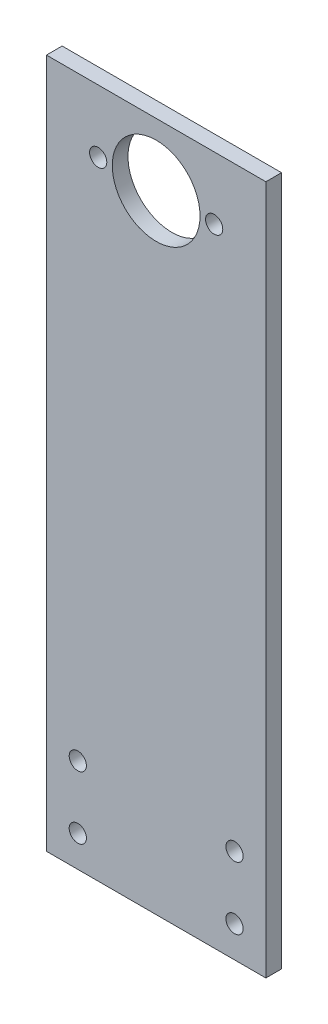
ISO-10303-21;
HEADER;
FILE_DESCRIPTION(('STEP AP214'),'2;1');
FILE_NAME('part.step','',(''),(''),'','','');
FILE_SCHEMA(('AUTOMOTIVE_DESIGN { 1 0 10303 214 1 1 1 1 }'));
ENDSEC;
DATA;
#1=APPLICATION_CONTEXT('core data for automotive mechanical design processes');
#2=APPLICATION_PROTOCOL_DEFINITION('international standard','automotive_design',2000,#1);
#3=PRODUCT_CONTEXT('',#1,'mechanical');
#4=PRODUCT('Part','Part','',(#3));
#5=PRODUCT_RELATED_PRODUCT_CATEGORY('part','',(#4));
#6=PRODUCT_DEFINITION_FORMATION('','',#4);
#7=PRODUCT_DEFINITION_CONTEXT('part definition',#1,'design');
#8=PRODUCT_DEFINITION('design','',#6,#7);
#9=PRODUCT_DEFINITION_SHAPE('','',#8);
#10=(LENGTH_UNIT() NAMED_UNIT(*) SI_UNIT(.MILLI.,.METRE.));
#11=(NAMED_UNIT(*) PLANE_ANGLE_UNIT() SI_UNIT($,.RADIAN.));
#12=(NAMED_UNIT(*) SI_UNIT($,.STERADIAN.) SOLID_ANGLE_UNIT());
#13=UNCERTAINTY_MEASURE_WITH_UNIT(LENGTH_MEASURE(1.E-05),#10,'distance_accuracy_value','');
#14=(GEOMETRIC_REPRESENTATION_CONTEXT(3) GLOBAL_UNCERTAINTY_ASSIGNED_CONTEXT((#13)) GLOBAL_UNIT_ASSIGNED_CONTEXT((#10,
#11,#12)) REPRESENTATION_CONTEXT('',''));
#15=CARTESIAN_POINT('',(0.,0.,0.));
#16=DIRECTION('',(0.,0.,1.));
#17=DIRECTION('',(1.,0.,0.));
#18=AXIS2_PLACEMENT_3D('',#15,#16,#17);
#19=CARTESIAN_POINT('',(0.,-120.000000000366,5.));
#20=DIRECTION('',(0.,1.,0.));
#21=DIRECTION('',(0.,0.,1.));
#22=AXIS2_PLACEMENT_3D('',#19,#20,#21);
#23=PLANE('',#22);
#24=DIRECTION('',(1.,0.,0.));
#25=VECTOR('',#24,1.);
#26=CARTESIAN_POINT('',(0.,-120.000000000366,0.));
#27=LINE('',#26,#25);
#28=CARTESIAN_POINT('',(-35.,-120.000000000366,0.));
#29=VERTEX_POINT('',#28);
#30=CARTESIAN_POINT('',(35.,-120.000000000366,0.));
#31=VERTEX_POINT('',#30);
#32=EDGE_CURVE('E120',#29,#31,#27,.T.);
#33=ORIENTED_EDGE('',*,*,#32,.T.);
#34=DIRECTION('',(0.,0.,-1.));
#35=VECTOR('',#34,1.);
#36=CARTESIAN_POINT('',(35.,-120.000000000366,5.));
#37=LINE('',#36,#35);
#38=CARTESIAN_POINT('',(35.,-120.000000000366,5.));
#39=VERTEX_POINT('',#38);
#40=EDGE_CURVE('E11',#39,#31,#37,.T.);
#41=ORIENTED_EDGE('',*,*,#40,.F.);
#42=DIRECTION('',(1.,0.,0.));
#43=VECTOR('',#42,1.);
#44=CARTESIAN_POINT('',(0.,-120.000000000366,5.));
#45=LINE('',#44,#43);
#46=CARTESIAN_POINT('',(-35.,-120.000000000366,5.));
#47=VERTEX_POINT('',#46);
#48=EDGE_CURVE('E85',#47,#39,#45,.T.);
#49=ORIENTED_EDGE('',*,*,#48,.F.);
#50=DIRECTION('',(0.,0.,-1.));
#51=VECTOR('',#50,1.);
#52=CARTESIAN_POINT('',(-35.,-120.000000000366,5.));
#53=LINE('',#52,#51);
#54=EDGE_CURVE('E52',#47,#29,#53,.T.);
#55=ORIENTED_EDGE('',*,*,#54,.T.);
#56=EDGE_LOOP('',(#33,#41,#49,#55));
#57=FACE_BOUND('',#56,.T.);
#58=ADVANCED_FACE('F35',(#57),#23,.F.);
#59=CARTESIAN_POINT('',(35.0000000000004,-1.38777878078145E-13,5.));
#60=DIRECTION('',(-1.,0.,0.));
#61=DIRECTION('',(0.,-1.,0.));
#62=AXIS2_PLACEMENT_3D('',#59,#60,#61);
#63=PLANE('',#62);
#64=DIRECTION('',(0.,1.,0.));
#65=VECTOR('',#64,1.);
#66=CARTESIAN_POINT('',(35.0000000000004,-1.38777878078145E-13,0.));
#67=LINE('',#66,#65);
#68=CARTESIAN_POINT('',(35.,100.,0.));
#69=VERTEX_POINT('',#68);
#70=EDGE_CURVE('E90',#31,#69,#67,.T.);
#71=ORIENTED_EDGE('',*,*,#70,.T.);
#72=DIRECTION('',(0.,0.,-1.));
#73=VECTOR('',#72,1.);
#74=CARTESIAN_POINT('',(35.,100.,5.));
#75=LINE('',#74,#73);
#76=CARTESIAN_POINT('',(35.,100.,5.));
#77=VERTEX_POINT('',#76);
#78=EDGE_CURVE('E44',#77,#69,#75,.T.);
#79=ORIENTED_EDGE('',*,*,#78,.F.);
#80=DIRECTION('',(0.,1.,0.));
#81=VECTOR('',#80,1.);
#82=CARTESIAN_POINT('',(35.0000000000004,-1.38777878078145E-13,5.));
#83=LINE('',#82,#81);
#84=EDGE_CURVE('E77',#39,#77,#83,.T.);
#85=ORIENTED_EDGE('',*,*,#84,.F.);
#86=ORIENTED_EDGE('',*,*,#40,.T.);
#87=EDGE_LOOP('',(#71,#79,#85,#86));
#88=FACE_BOUND('',#87,.T.);
#89=ADVANCED_FACE('F89',(#88),#63,.F.);
#90=CARTESIAN_POINT('',(0.,100.,5.));
#91=DIRECTION('',(0.,1.,0.));
#92=DIRECTION('',(0.,0.,1.));
#93=AXIS2_PLACEMENT_3D('',#90,#91,#92);
#94=PLANE('',#93);
#95=DIRECTION('',(1.,0.,0.));
#96=VECTOR('',#95,1.);
#97=CARTESIAN_POINT('',(0.,100.,0.));
#98=LINE('',#97,#96);
#99=CARTESIAN_POINT('',(-35.,100.,0.));
#100=VERTEX_POINT('',#99);
#101=EDGE_CURVE('E123',#100,#69,#98,.T.);
#102=ORIENTED_EDGE('',*,*,#101,.F.);
#103=DIRECTION('',(0.,0.,-1.));
#104=VECTOR('',#103,1.);
#105=CARTESIAN_POINT('',(-35.,100.,5.));
#106=LINE('',#105,#104);
#107=CARTESIAN_POINT('',(-35.,100.,5.));
#108=VERTEX_POINT('',#107);
#109=EDGE_CURVE('E66',#108,#100,#106,.T.);
#110=ORIENTED_EDGE('',*,*,#109,.F.);
#111=DIRECTION('',(1.,0.,0.));
#112=VECTOR('',#111,1.);
#113=CARTESIAN_POINT('',(0.,100.,5.));
#114=LINE('',#113,#112);
#115=EDGE_CURVE('E84',#108,#77,#114,.T.);
#116=ORIENTED_EDGE('',*,*,#115,.T.);
#117=ORIENTED_EDGE('',*,*,#78,.T.);
#118=EDGE_LOOP('',(#102,#110,#116,#117));
#119=FACE_BOUND('',#118,.T.);
#120=ADVANCED_FACE('F93',(#119),#94,.T.);
#121=CARTESIAN_POINT('',(-18.5,80.,5.));
#122=DIRECTION('',(0.,0.,-1.));
#123=DIRECTION('',(-1.,0.,0.));
#124=AXIS2_PLACEMENT_3D('',#121,#122,#123);
#125=CYLINDRICAL_SURFACE('',#124,2.75);
#126=CARTESIAN_POINT('',(-18.5,80.,5.));
#127=DIRECTION('',(0.,0.,1.));
#128=DIRECTION('',(1.,0.,0.));
#129=AXIS2_PLACEMENT_3D('',#126,#127,#128);
#130=CIRCLE('',#129,2.75);
#131=CARTESIAN_POINT('',(-15.75,80.,5.));
#132=VERTEX_POINT('',#131);
#133=EDGE_CURVE('E151',#132,#132,#130,.T.);
#134=ORIENTED_EDGE('',*,*,#133,.T.);
#135=EDGE_LOOP('',(#134));
#136=FACE_BOUND('',#135,.T.);
#137=CARTESIAN_POINT('',(-18.5,80.,0.));
#138=DIRECTION('',(0.,0.,1.));
#139=DIRECTION('',(1.,0.,0.));
#140=AXIS2_PLACEMENT_3D('',#137,#138,#139);
#141=CIRCLE('',#140,2.75);
#142=CARTESIAN_POINT('',(-15.75,80.,0.));
#143=VERTEX_POINT('',#142);
#144=EDGE_CURVE('E117',#143,#143,#141,.T.);
#145=ORIENTED_EDGE('',*,*,#144,.F.);
#146=EDGE_LOOP('',(#145));
#147=FACE_BOUND('',#146,.T.);
#148=ADVANCED_FACE('F155',(#136,#147),#125,.F.);
#149=CARTESIAN_POINT('',(18.5,80.,5.));
#150=DIRECTION('',(0.,0.,-1.));
#151=DIRECTION('',(-1.,0.,0.));
#152=AXIS2_PLACEMENT_3D('',#149,#150,#151);
#153=CYLINDRICAL_SURFACE('',#152,2.75);
#154=CARTESIAN_POINT('',(18.5,80.,5.));
#155=DIRECTION('',(0.,0.,1.));
#156=DIRECTION('',(1.,0.,0.));
#157=AXIS2_PLACEMENT_3D('',#154,#155,#156);
#158=CIRCLE('',#157,2.75);
#159=CARTESIAN_POINT('',(21.25,80.,5.));
#160=VERTEX_POINT('',#159);
#161=EDGE_CURVE('E148',#160,#160,#158,.T.);
#162=ORIENTED_EDGE('',*,*,#161,.T.);
#163=EDGE_LOOP('',(#162));
#164=FACE_BOUND('',#163,.T.);
#165=CARTESIAN_POINT('',(18.5,80.,0.));
#166=DIRECTION('',(0.,0.,1.));
#167=DIRECTION('',(1.,0.,0.));
#168=AXIS2_PLACEMENT_3D('',#165,#166,#167);
#169=CIRCLE('',#168,2.75);
#170=CARTESIAN_POINT('',(21.25,80.,0.));
#171=VERTEX_POINT('',#170);
#172=EDGE_CURVE('E114',#171,#171,#169,.T.);
#173=ORIENTED_EDGE('',*,*,#172,.F.);
#174=EDGE_LOOP('',(#173));
#175=FACE_BOUND('',#174,.T.);
#176=ADVANCED_FACE('F181',(#164,#175),#153,.F.);
#177=CARTESIAN_POINT('',(-25.,-90.0000000000001,5.));
#178=DIRECTION('',(0.,0.,-1.));
#179=DIRECTION('',(-1.,0.,0.));
#180=AXIS2_PLACEMENT_3D('',#177,#178,#179);
#181=CYLINDRICAL_SURFACE('',#180,2.75);
#182=CARTESIAN_POINT('',(-25.,-90.0000000000001,5.));
#183=DIRECTION('',(0.,0.,1.));
#184=DIRECTION('',(1.,0.,0.));
#185=AXIS2_PLACEMENT_3D('',#182,#183,#184);
#186=CIRCLE('',#185,2.75);
#187=CARTESIAN_POINT('',(-22.25,-90.0000000000001,5.));
#188=VERTEX_POINT('',#187);
#189=EDGE_CURVE('E145',#188,#188,#186,.T.);
#190=ORIENTED_EDGE('',*,*,#189,.T.);
#191=EDGE_LOOP('',(#190));
#192=FACE_BOUND('',#191,.T.);
#193=CARTESIAN_POINT('',(-25.,-90.0000000000001,0.));
#194=DIRECTION('',(0.,0.,1.));
#195=DIRECTION('',(1.,0.,0.));
#196=AXIS2_PLACEMENT_3D('',#193,#194,#195);
#197=CIRCLE('',#196,2.75);
#198=CARTESIAN_POINT('',(-22.25,-90.0000000000001,0.));
#199=VERTEX_POINT('',#198);
#200=EDGE_CURVE('E111',#199,#199,#197,.T.);
#201=ORIENTED_EDGE('',*,*,#200,.F.);
#202=EDGE_LOOP('',(#201));
#203=FACE_BOUND('',#202,.T.);
#204=ADVANCED_FACE('F184',(#192,#203),#181,.F.);
#205=CARTESIAN_POINT('',(25.,-90.0000000000001,5.));
#206=DIRECTION('',(0.,0.,-1.));
#207=DIRECTION('',(-1.,0.,0.));
#208=AXIS2_PLACEMENT_3D('',#205,#206,#207);
#209=CYLINDRICAL_SURFACE('',#208,2.75);
#210=CARTESIAN_POINT('',(25.,-90.0000000000001,5.));
#211=DIRECTION('',(0.,0.,1.));
#212=DIRECTION('',(1.,0.,0.));
#213=AXIS2_PLACEMENT_3D('',#210,#211,#212);
#214=CIRCLE('',#213,2.75);
#215=CARTESIAN_POINT('',(27.75,-90.0000000000001,5.));
#216=VERTEX_POINT('',#215);
#217=EDGE_CURVE('E142',#216,#216,#214,.T.);
#218=ORIENTED_EDGE('',*,*,#217,.T.);
#219=EDGE_LOOP('',(#218));
#220=FACE_BOUND('',#219,.T.);
#221=CARTESIAN_POINT('',(25.,-90.0000000000001,0.));
#222=DIRECTION('',(0.,0.,1.));
#223=DIRECTION('',(1.,0.,0.));
#224=AXIS2_PLACEMENT_3D('',#221,#222,#223);
#225=CIRCLE('',#224,2.75);
#226=CARTESIAN_POINT('',(27.75,-90.0000000000001,0.));
#227=VERTEX_POINT('',#226);
#228=EDGE_CURVE('E108',#227,#227,#225,.T.);
#229=ORIENTED_EDGE('',*,*,#228,.F.);
#230=EDGE_LOOP('',(#229));
#231=FACE_BOUND('',#230,.T.);
#232=ADVANCED_FACE('F188',(#220,#231),#209,.F.);
#233=CARTESIAN_POINT('',(25.,-110.,5.));
#234=DIRECTION('',(0.,0.,-1.));
#235=DIRECTION('',(-1.,0.,0.));
#236=AXIS2_PLACEMENT_3D('',#233,#234,#235);
#237=CYLINDRICAL_SURFACE('',#236,2.75);
#238=CARTESIAN_POINT('',(25.,-110.,5.));
#239=DIRECTION('',(0.,0.,1.));
#240=DIRECTION('',(1.,0.,0.));
#241=AXIS2_PLACEMENT_3D('',#238,#239,#240);
#242=CIRCLE('',#241,2.75);
#243=CARTESIAN_POINT('',(27.75,-110.,5.));
#244=VERTEX_POINT('',#243);
#245=EDGE_CURVE('E137',#244,#244,#242,.T.);
#246=ORIENTED_EDGE('',*,*,#245,.T.);
#247=EDGE_LOOP('',(#246));
#248=FACE_BOUND('',#247,.T.);
#249=CARTESIAN_POINT('',(25.,-110.,0.));
#250=DIRECTION('',(0.,0.,1.));
#251=DIRECTION('',(1.,0.,0.));
#252=AXIS2_PLACEMENT_3D('',#249,#250,#251);
#253=CIRCLE('',#252,2.75);
#254=CARTESIAN_POINT('',(27.75,-110.,0.));
#255=VERTEX_POINT('',#254);
#256=EDGE_CURVE('E105',#255,#255,#253,.T.);
#257=ORIENTED_EDGE('',*,*,#256,.F.);
#258=EDGE_LOOP('',(#257));
#259=FACE_BOUND('',#258,.T.);
#260=ADVANCED_FACE('F192',(#248,#259),#237,.F.);
#261=CARTESIAN_POINT('',(-25.,-110.,5.));
#262=DIRECTION('',(0.,0.,-1.));
#263=DIRECTION('',(-1.,0.,0.));
#264=AXIS2_PLACEMENT_3D('',#261,#262,#263);
#265=CYLINDRICAL_SURFACE('',#264,2.75);
#266=CARTESIAN_POINT('',(-25.,-110.,5.));
#267=DIRECTION('',(0.,0.,1.));
#268=DIRECTION('',(1.,0.,0.));
#269=AXIS2_PLACEMENT_3D('',#266,#267,#268);
#270=CIRCLE('',#269,2.75);
#271=CARTESIAN_POINT('',(-22.25,-110.,5.));
#272=VERTEX_POINT('',#271);
#273=EDGE_CURVE('E132',#272,#272,#270,.T.);
#274=ORIENTED_EDGE('',*,*,#273,.T.);
#275=EDGE_LOOP('',(#274));
#276=FACE_BOUND('',#275,.T.);
#277=CARTESIAN_POINT('',(-25.,-110.,0.));
#278=DIRECTION('',(0.,0.,1.));
#279=DIRECTION('',(1.,0.,0.));
#280=AXIS2_PLACEMENT_3D('',#277,#278,#279);
#281=CIRCLE('',#280,2.75);
#282=CARTESIAN_POINT('',(-22.25,-110.,0.));
#283=VERTEX_POINT('',#282);
#284=EDGE_CURVE('E102',#283,#283,#281,.T.);
#285=ORIENTED_EDGE('',*,*,#284,.F.);
#286=EDGE_LOOP('',(#285));
#287=FACE_BOUND('',#286,.T.);
#288=ADVANCED_FACE('F195',(#276,#287),#265,.F.);
#289=CARTESIAN_POINT('',(0.,80.,5.));
#290=DIRECTION('',(0.,0.,-1.));
#291=DIRECTION('',(-1.,0.,0.));
#292=AXIS2_PLACEMENT_3D('',#289,#290,#291);
#293=CYLINDRICAL_SURFACE('',#292,14.);
#294=CARTESIAN_POINT('',(0.,80.,5.));
#295=DIRECTION('',(0.,0.,1.));
#296=DIRECTION('',(1.,0.,0.));
#297=AXIS2_PLACEMENT_3D('',#294,#295,#296);
#298=CIRCLE('',#297,14.);
#299=CARTESIAN_POINT('',(14.,80.,5.));
#300=VERTEX_POINT('',#299);
#301=EDGE_CURVE('E128',#300,#300,#298,.T.);
#302=ORIENTED_EDGE('',*,*,#301,.T.);
#303=EDGE_LOOP('',(#302));
#304=FACE_BOUND('',#303,.T.);
#305=CARTESIAN_POINT('',(0.,80.,0.));
#306=DIRECTION('',(0.,0.,1.));
#307=DIRECTION('',(1.,0.,0.));
#308=AXIS2_PLACEMENT_3D('',#305,#306,#307);
#309=CIRCLE('',#308,14.);
#310=CARTESIAN_POINT('',(14.,80.,0.));
#311=VERTEX_POINT('',#310);
#312=EDGE_CURVE('E99',#311,#311,#309,.T.);
#313=ORIENTED_EDGE('',*,*,#312,.F.);
#314=EDGE_LOOP('',(#313));
#315=FACE_BOUND('',#314,.T.);
#316=ADVANCED_FACE('F37',(#304,#315),#293,.F.);
#317=CARTESIAN_POINT('',(-35.,0.,5.));
#318=DIRECTION('',(-1.,0.,0.));
#319=DIRECTION('',(0.,-1.,0.));
#320=AXIS2_PLACEMENT_3D('',#317,#318,#319);
#321=PLANE('',#320);
#322=DIRECTION('',(0.,1.,0.));
#323=VECTOR('',#322,1.);
#324=CARTESIAN_POINT('',(-35.,0.,0.));
#325=LINE('',#324,#323);
#326=EDGE_CURVE('E125',#29,#100,#325,.T.);
#327=ORIENTED_EDGE('',*,*,#326,.F.);
#328=ORIENTED_EDGE('',*,*,#54,.F.);
#329=DIRECTION('',(0.,1.,0.));
#330=VECTOR('',#329,1.);
#331=CARTESIAN_POINT('',(-35.,0.,5.));
#332=LINE('',#331,#330);
#333=EDGE_CURVE('E94',#47,#108,#332,.T.);
#334=ORIENTED_EDGE('',*,*,#333,.T.);
#335=ORIENTED_EDGE('',*,*,#109,.T.);
#336=EDGE_LOOP('',(#327,#328,#334,#335));
#337=FACE_BOUND('',#336,.T.);
#338=ADVANCED_FACE('F160',(#337),#321,.T.);
#339=CARTESIAN_POINT('',(0.,0.,5.));
#340=DIRECTION('',(0.,0.,1.));
#341=DIRECTION('',(1.,0.,0.));
#342=AXIS2_PLACEMENT_3D('',#339,#340,#341);
#343=PLANE('',#342);
#344=ORIENTED_EDGE('',*,*,#301,.F.);
#345=EDGE_LOOP('',(#344));
#346=FACE_BOUND('',#345,.T.);
#347=ORIENTED_EDGE('',*,*,#273,.F.);
#348=EDGE_LOOP('',(#347));
#349=FACE_BOUND('',#348,.T.);
#350=ORIENTED_EDGE('',*,*,#245,.F.);
#351=EDGE_LOOP('',(#350));
#352=FACE_BOUND('',#351,.T.);
#353=ORIENTED_EDGE('',*,*,#217,.F.);
#354=EDGE_LOOP('',(#353));
#355=FACE_BOUND('',#354,.T.);
#356=ORIENTED_EDGE('',*,*,#189,.F.);
#357=EDGE_LOOP('',(#356));
#358=FACE_BOUND('',#357,.T.);
#359=ORIENTED_EDGE('',*,*,#161,.F.);
#360=EDGE_LOOP('',(#359));
#361=FACE_BOUND('',#360,.T.);
#362=ORIENTED_EDGE('',*,*,#133,.F.);
#363=EDGE_LOOP('',(#362));
#364=FACE_BOUND('',#363,.T.);
#365=ORIENTED_EDGE('',*,*,#48,.T.);
#366=ORIENTED_EDGE('',*,*,#84,.T.);
#367=ORIENTED_EDGE('',*,*,#115,.F.);
#368=ORIENTED_EDGE('',*,*,#333,.F.);
#369=EDGE_LOOP('',(#365,#366,#367,#368));
#370=FACE_BOUND('',#369,.T.);
#371=ADVANCED_FACE('F81',(#346,#349,#352,#355,#358,#361,#364,#370),#343,.T.);
#372=CARTESIAN_POINT('',(0.,0.,0.));
#373=DIRECTION('',(0.,0.,1.));
#374=DIRECTION('',(1.,0.,0.));
#375=AXIS2_PLACEMENT_3D('',#372,#373,#374);
#376=PLANE('',#375);
#377=ORIENTED_EDGE('',*,*,#312,.T.);
#378=EDGE_LOOP('',(#377));
#379=FACE_BOUND('',#378,.T.);
#380=ORIENTED_EDGE('',*,*,#284,.T.);
#381=EDGE_LOOP('',(#380));
#382=FACE_BOUND('',#381,.T.);
#383=ORIENTED_EDGE('',*,*,#256,.T.);
#384=EDGE_LOOP('',(#383));
#385=FACE_BOUND('',#384,.T.);
#386=ORIENTED_EDGE('',*,*,#228,.T.);
#387=EDGE_LOOP('',(#386));
#388=FACE_BOUND('',#387,.T.);
#389=ORIENTED_EDGE('',*,*,#200,.T.);
#390=EDGE_LOOP('',(#389));
#391=FACE_BOUND('',#390,.T.);
#392=ORIENTED_EDGE('',*,*,#172,.T.);
#393=EDGE_LOOP('',(#392));
#394=FACE_BOUND('',#393,.T.);
#395=ORIENTED_EDGE('',*,*,#144,.T.);
#396=EDGE_LOOP('',(#395));
#397=FACE_BOUND('',#396,.T.);
#398=ORIENTED_EDGE('',*,*,#32,.F.);
#399=ORIENTED_EDGE('',*,*,#326,.T.);
#400=ORIENTED_EDGE('',*,*,#101,.T.);
#401=ORIENTED_EDGE('',*,*,#70,.F.);
#402=EDGE_LOOP('',(#398,#399,#400,#401));
#403=FACE_BOUND('',#402,.T.);
#404=ADVANCED_FACE('F159',(#379,#382,#385,#388,#391,#394,#397,#403),#376,.F.);
#405=CLOSED_SHELL('',(#58,#89,#120,#148,#176,#204,#232,#260,#288,#316,#338,#371,#404));
#406=MANIFOLD_SOLID_BREP('B2',#405);
#407=ADVANCED_BREP_SHAPE_REPRESENTATION('',(#18,#406),#14);
#408=SHAPE_DEFINITION_REPRESENTATION(#9,#407);
ENDSEC;
END-ISO-10303-21;
